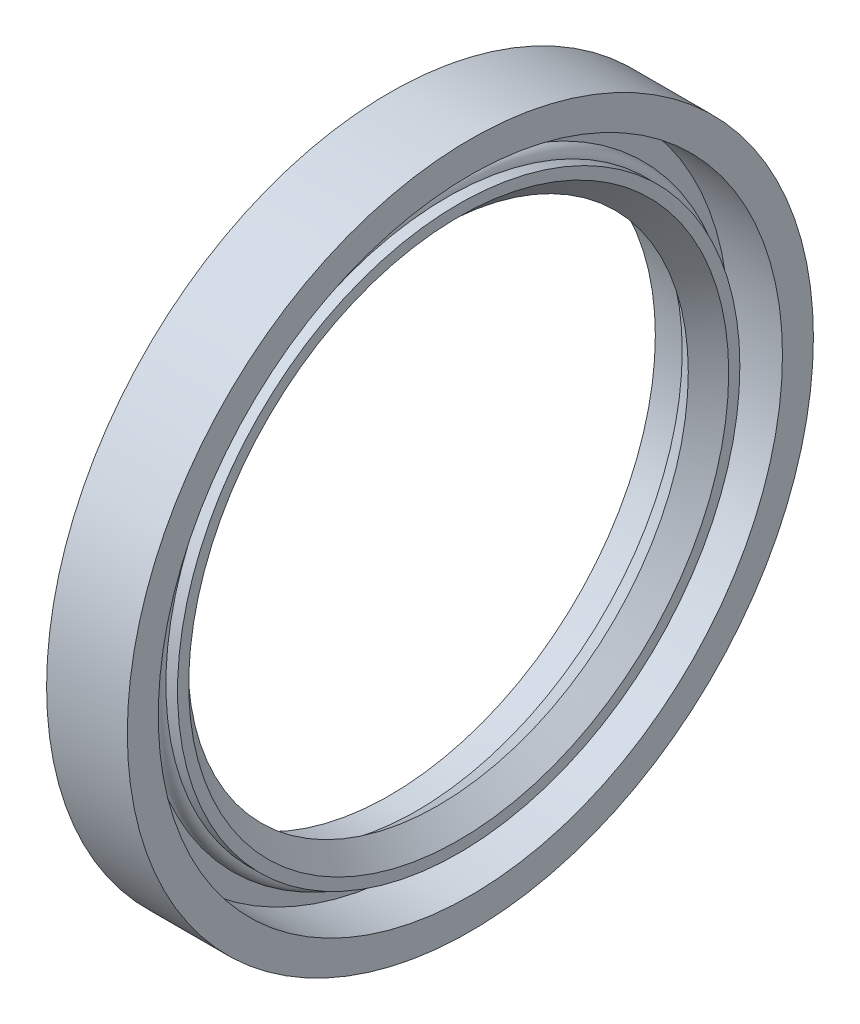
ISO-10303-21;
HEADER;
FILE_DESCRIPTION(('STEP AP214'),'2;1');
FILE_NAME('part.step','',(''),(''),'','','');
FILE_SCHEMA(('AUTOMOTIVE_DESIGN { 1 0 10303 214 1 1 1 1 }'));
ENDSEC;
DATA;
#1=APPLICATION_CONTEXT('core data for automotive mechanical design processes');
#2=APPLICATION_PROTOCOL_DEFINITION('international standard','automotive_design',2000,#1);
#3=PRODUCT_CONTEXT('',#1,'mechanical');
#4=PRODUCT('Part','Part','',(#3));
#5=PRODUCT_RELATED_PRODUCT_CATEGORY('part','',(#4));
#6=PRODUCT_DEFINITION_FORMATION('','',#4);
#7=PRODUCT_DEFINITION_CONTEXT('part definition',#1,'design');
#8=PRODUCT_DEFINITION('design','',#6,#7);
#9=PRODUCT_DEFINITION_SHAPE('','',#8);
#10=(LENGTH_UNIT() NAMED_UNIT(*) SI_UNIT(.MILLI.,.METRE.));
#11=(NAMED_UNIT(*) PLANE_ANGLE_UNIT() SI_UNIT($,.RADIAN.));
#12=(NAMED_UNIT(*) SI_UNIT($,.STERADIAN.) SOLID_ANGLE_UNIT());
#13=UNCERTAINTY_MEASURE_WITH_UNIT(LENGTH_MEASURE(1.E-05),#10,'distance_accuracy_value','');
#14=(GEOMETRIC_REPRESENTATION_CONTEXT(3) GLOBAL_UNCERTAINTY_ASSIGNED_CONTEXT((#13)) GLOBAL_UNIT_ASSIGNED_CONTEXT((#10,
#11,#12)) REPRESENTATION_CONTEXT('',''));
#15=CARTESIAN_POINT('',(0.,0.,0.));
#16=DIRECTION('',(0.,0.,1.));
#17=DIRECTION('',(1.,0.,0.));
#18=AXIS2_PLACEMENT_3D('',#15,#16,#17);
#19=CARTESIAN_POINT('',(10.,0.,0.));
#20=DIRECTION('',(1.,0.,0.));
#21=DIRECTION('',(0.,0.,-1.));
#22=AXIS2_PLACEMENT_3D('',#19,#20,#21);
#23=CYLINDRICAL_SURFACE('',#22,42.5);
#24=CARTESIAN_POINT('',(0.,0.,0.));
#25=DIRECTION('',(1.,0.,0.));
#26=DIRECTION('',(0.,0.,-1.));
#27=AXIS2_PLACEMENT_3D('',#24,#25,#26);
#28=CIRCLE('',#27,42.5);
#29=CARTESIAN_POINT('',(0.,0.,-42.5));
#30=VERTEX_POINT('',#29);
#31=EDGE_CURVE('E72',#30,#30,#28,.T.);
#32=ORIENTED_EDGE('',*,*,#31,.T.);
#33=EDGE_LOOP('',(#32));
#34=FACE_BOUND('',#33,.T.);
#35=CARTESIAN_POINT('',(10.,0.,0.));
#36=DIRECTION('',(1.,0.,0.));
#37=DIRECTION('',(0.,0.,-1.));
#38=AXIS2_PLACEMENT_3D('',#35,#36,#37);
#39=CIRCLE('',#38,42.5);
#40=CARTESIAN_POINT('',(10.,0.,-42.5));
#41=VERTEX_POINT('',#40);
#42=EDGE_CURVE('E68',#41,#41,#39,.T.);
#43=ORIENTED_EDGE('',*,*,#42,.F.);
#44=EDGE_LOOP('',(#43));
#45=FACE_BOUND('',#44,.T.);
#46=ADVANCED_FACE('F15',(#34,#45),#23,.T.);
#47=CARTESIAN_POINT('',(0.,42.5,0.));
#48=DIRECTION('',(-1.,0.,0.));
#49=DIRECTION('',(0.,0.,1.));
#50=AXIS2_PLACEMENT_3D('',#47,#48,#49);
#51=PLANE('',#50);
#52=CARTESIAN_POINT('',(0.,0.,0.));
#53=DIRECTION('',(1.,0.,0.));
#54=DIRECTION('',(0.,0.,-1.));
#55=AXIS2_PLACEMENT_3D('',#52,#53,#54);
#56=CIRCLE('',#55,32.916666666667);
#57=CARTESIAN_POINT('',(0.,0.,-32.916666666667));
#58=VERTEX_POINT('',#57);
#59=EDGE_CURVE('E64',#58,#58,#56,.T.);
#60=ORIENTED_EDGE('',*,*,#59,.T.);
#61=EDGE_LOOP('',(#60));
#62=FACE_BOUND('',#61,.T.);
#63=ORIENTED_EDGE('',*,*,#31,.F.);
#64=EDGE_LOOP('',(#63));
#65=FACE_BOUND('',#64,.T.);
#66=ADVANCED_FACE('F81',(#62,#65),#51,.T.);
#67=CARTESIAN_POINT('',(10.,38.666666666667,0.));
#68=DIRECTION('',(1.,0.,0.));
#69=DIRECTION('',(0.,0.,-1.));
#70=AXIS2_PLACEMENT_3D('',#67,#68,#69);
#71=PLANE('',#70);
#72=ORIENTED_EDGE('',*,*,#42,.T.);
#73=EDGE_LOOP('',(#72));
#74=FACE_BOUND('',#73,.T.);
#75=CARTESIAN_POINT('',(10.,0.,0.));
#76=DIRECTION('',(1.,0.,0.));
#77=DIRECTION('',(0.,0.,-1.));
#78=AXIS2_PLACEMENT_3D('',#75,#76,#77);
#79=CIRCLE('',#78,38.666666666667);
#80=CARTESIAN_POINT('',(10.,0.,-38.666666666667));
#81=VERTEX_POINT('',#80);
#82=EDGE_CURVE('E60',#81,#81,#79,.T.);
#83=ORIENTED_EDGE('',*,*,#82,.F.);
#84=EDGE_LOOP('',(#83));
#85=FACE_BOUND('',#84,.T.);
#86=ADVANCED_FACE('F83',(#74,#85),#71,.T.);
#87=CARTESIAN_POINT('',(10.,0.,0.));
#88=DIRECTION('',(1.,0.,0.));
#89=DIRECTION('',(0.,0.,-1.));
#90=AXIS2_PLACEMENT_3D('',#87,#88,#89);
#91=CYLINDRICAL_SURFACE('',#90,32.916666666667);
#92=CARTESIAN_POINT('',(3.3333333333333,0.,0.));
#93=DIRECTION('',(1.,0.,0.));
#94=DIRECTION('',(0.,0.,-1.));
#95=AXIS2_PLACEMENT_3D('',#92,#93,#94);
#96=CIRCLE('',#95,32.916666666667);
#97=CARTESIAN_POINT('',(3.3333333333333,0.,-32.916666666667));
#98=VERTEX_POINT('',#97);
#99=EDGE_CURVE('E56',#98,#98,#96,.T.);
#100=ORIENTED_EDGE('',*,*,#99,.T.);
#101=EDGE_LOOP('',(#100));
#102=FACE_BOUND('',#101,.T.);
#103=ORIENTED_EDGE('',*,*,#59,.F.);
#104=EDGE_LOOP('',(#103));
#105=FACE_BOUND('',#104,.T.);
#106=ADVANCED_FACE('F91',(#102,#105),#91,.F.);
#107=CARTESIAN_POINT('',(10.,0.,0.));
#108=DIRECTION('',(1.,0.,0.));
#109=DIRECTION('',(0.,0.,-1.));
#110=AXIS2_PLACEMENT_3D('',#107,#108,#109);
#111=CYLINDRICAL_SURFACE('',#110,38.666666666667);
#112=ORIENTED_EDGE('',*,*,#82,.T.);
#113=EDGE_LOOP('',(#112));
#114=FACE_BOUND('',#113,.T.);
#115=CARTESIAN_POINT('',(3.3333333333333,0.,0.));
#116=DIRECTION('',(1.,0.,0.));
#117=DIRECTION('',(0.,0.,-1.));
#118=AXIS2_PLACEMENT_3D('',#115,#116,#117);
#119=CIRCLE('',#118,38.666666666667);
#120=CARTESIAN_POINT('',(3.3333333333333,0.,-38.666666666667));
#121=VERTEX_POINT('',#120);
#122=EDGE_CURVE('E52',#121,#121,#119,.T.);
#123=ORIENTED_EDGE('',*,*,#122,.F.);
#124=EDGE_LOOP('',(#123));
#125=FACE_BOUND('',#124,.T.);
#126=ADVANCED_FACE('F98',(#114,#125),#111,.F.);
#127=CARTESIAN_POINT('',(3.3333333333333,0.,0.));
#128=DIRECTION('',(-1.,0.,0.));
#129=DIRECTION('',(0.,0.,1.));
#130=AXIS2_PLACEMENT_3D('',#127,#128,#129);
#131=CONICAL_SURFACE('',#130,32.916666666667,0.623199329934142);
#132=CARTESIAN_POINT('',(6.,0.,0.));
#133=DIRECTION('',(1.,0.,0.));
#134=DIRECTION('',(0.,0.,-1.));
#135=AXIS2_PLACEMENT_3D('',#132,#133,#134);
#136=CIRCLE('',#135,31.);
#137=CARTESIAN_POINT('',(6.,0.,-31.));
#138=VERTEX_POINT('',#137);
#139=EDGE_CURVE('E48',#138,#138,#136,.T.);
#140=ORIENTED_EDGE('',*,*,#139,.T.);
#141=EDGE_LOOP('',(#140));
#142=FACE_BOUND('',#141,.T.);
#143=ORIENTED_EDGE('',*,*,#99,.F.);
#144=EDGE_LOOP('',(#143));
#145=FACE_BOUND('',#144,.T.);
#146=ADVANCED_FACE('F102',(#142,#145),#131,.F.);
#147=CARTESIAN_POINT('',(3.3333333333333,34.833333333333,0.));
#148=DIRECTION('',(1.,0.,0.));
#149=DIRECTION('',(0.,0.,-1.));
#150=AXIS2_PLACEMENT_3D('',#147,#148,#149);
#151=PLANE('',#150);
#152=ORIENTED_EDGE('',*,*,#122,.T.);
#153=EDGE_LOOP('',(#152));
#154=FACE_BOUND('',#153,.T.);
#155=CARTESIAN_POINT('',(3.3333333333333,0.,0.));
#156=DIRECTION('',(1.,0.,0.));
#157=DIRECTION('',(0.,0.,-1.));
#158=AXIS2_PLACEMENT_3D('',#155,#156,#157);
#159=CIRCLE('',#158,34.833333333333);
#160=CARTESIAN_POINT('',(3.3333333333333,0.,-34.833333333333));
#161=VERTEX_POINT('',#160);
#162=EDGE_CURVE('E44',#161,#161,#159,.T.);
#163=ORIENTED_EDGE('',*,*,#162,.F.);
#164=EDGE_LOOP('',(#163));
#165=FACE_BOUND('',#164,.T.);
#166=ADVANCED_FACE('F106',(#154,#165),#151,.T.);
#167=CARTESIAN_POINT('',(6.,0.,0.));
#168=DIRECTION('',(1.,0.,0.));
#169=DIRECTION('',(0.,0.,-1.));
#170=AXIS2_PLACEMENT_3D('',#167,#168,#169);
#171=CONICAL_SURFACE('',#170,31.,0.764124777373319);
#172=CARTESIAN_POINT('',(8.5555555,0.,0.));
#173=DIRECTION('',(1.,0.,0.));
#174=DIRECTION('',(0.,0.,-1.));
#175=AXIS2_PLACEMENT_3D('',#172,#173,#174);
#176=CIRCLE('',#175,33.449074020833);
#177=CARTESIAN_POINT('',(8.5555555,0.,-33.449074020833));
#178=VERTEX_POINT('',#177);
#179=EDGE_CURVE('E38',#178,#178,#176,.T.);
#180=ORIENTED_EDGE('',*,*,#179,.T.);
#181=EDGE_LOOP('',(#180));
#182=FACE_BOUND('',#181,.T.);
#183=ORIENTED_EDGE('',*,*,#139,.F.);
#184=EDGE_LOOP('',(#183));
#185=FACE_BOUND('',#184,.T.);
#186=ADVANCED_FACE('F110',(#182,#185),#171,.F.);
#187=CARTESIAN_POINT('',(10.,0.,0.));
#188=DIRECTION('',(1.,0.,0.));
#189=DIRECTION('',(0.,0.,-1.));
#190=AXIS2_PLACEMENT_3D('',#187,#188,#189);
#191=CYLINDRICAL_SURFACE('',#190,34.833333333333);
#192=ORIENTED_EDGE('',*,*,#162,.T.);
#193=EDGE_LOOP('',(#192));
#194=FACE_BOUND('',#193,.T.);
#195=CARTESIAN_POINT('',(4.888889,0.,0.));
#196=DIRECTION('',(1.,0.,0.));
#197=DIRECTION('',(0.,0.,-1.));
#198=AXIS2_PLACEMENT_3D('',#195,#196,#197);
#199=CIRCLE('',#198,34.833333333333);
#200=CARTESIAN_POINT('',(4.888889,0.,-34.833333333333));
#201=VERTEX_POINT('',#200);
#202=EDGE_CURVE('E31',#201,#201,#199,.T.);
#203=ORIENTED_EDGE('',*,*,#202,.F.);
#204=EDGE_LOOP('',(#203));
#205=FACE_BOUND('',#204,.T.);
#206=ADVANCED_FACE('F114',(#194,#205),#191,.T.);
#207=CARTESIAN_POINT('',(8.5555555,33.449074020833,0.));
#208=DIRECTION('',(1.,0.,0.));
#209=DIRECTION('',(0.,0.,-1.));
#210=AXIS2_PLACEMENT_3D('',#207,#208,#209);
#211=PLANE('',#210);
#212=CARTESIAN_POINT('',(8.5555555,0.,0.));
#213=DIRECTION('',(1.,0.,0.));
#214=DIRECTION('',(0.,0.,-1.));
#215=AXIS2_PLACEMENT_3D('',#212,#213,#214);
#216=CIRCLE('',#215,34.833333333333);
#217=CARTESIAN_POINT('',(8.5555555,0.,-34.833333333333));
#218=VERTEX_POINT('',#217);
#219=EDGE_CURVE('E23',#218,#218,#216,.T.);
#220=ORIENTED_EDGE('',*,*,#219,.T.);
#221=EDGE_LOOP('',(#220));
#222=FACE_BOUND('',#221,.T.);
#223=ORIENTED_EDGE('',*,*,#179,.F.);
#224=EDGE_LOOP('',(#223));
#225=FACE_BOUND('',#224,.T.);
#226=ADVANCED_FACE('F118',(#222,#225),#211,.T.);
#227=CARTESIAN_POINT('',(6.,0.,0.));
#228=DIRECTION('',(1.,0.,0.));
#229=DIRECTION('',(0.,0.,-1.));
#230=AXIS2_PLACEMENT_3D('',#227,#228,#229);
#231=TOROIDAL_SURFACE('',#230,34.833333333333,1.111111);
#232=ORIENTED_EDGE('',*,*,#202,.T.);
#233=EDGE_LOOP('',(#232));
#234=FACE_BOUND('',#233,.T.);
#235=CARTESIAN_POINT('',(7.111111,0.,0.));
#236=DIRECTION('',(1.,0.,0.));
#237=DIRECTION('',(0.,0.,-1.));
#238=AXIS2_PLACEMENT_3D('',#235,#236,#237);
#239=CIRCLE('',#238,34.833333333333);
#240=CARTESIAN_POINT('',(7.111111,0.,-34.833333333333));
#241=VERTEX_POINT('',#240);
#242=EDGE_CURVE('E10',#241,#241,#239,.T.);
#243=ORIENTED_EDGE('',*,*,#242,.F.);
#244=EDGE_LOOP('',(#243));
#245=FACE_BOUND('',#244,.T.);
#246=ADVANCED_FACE('F121',(#234,#245),#231,.T.);
#247=CARTESIAN_POINT('',(10.,0.,0.));
#248=DIRECTION('',(1.,0.,0.));
#249=DIRECTION('',(0.,0.,-1.));
#250=AXIS2_PLACEMENT_3D('',#247,#248,#249);
#251=CYLINDRICAL_SURFACE('',#250,34.833333333333);
#252=ORIENTED_EDGE('',*,*,#242,.T.);
#253=EDGE_LOOP('',(#252));
#254=FACE_BOUND('',#253,.T.);
#255=ORIENTED_EDGE('',*,*,#219,.F.);
#256=EDGE_LOOP('',(#255));
#257=FACE_BOUND('',#256,.T.);
#258=ADVANCED_FACE('F17',(#254,#257),#251,.T.);
#259=CLOSED_SHELL('',(#46,#66,#86,#106,#126,#146,#166,#186,#206,#226,#246,#258));
#260=MANIFOLD_SOLID_BREP('B1',#259);
#261=ADVANCED_BREP_SHAPE_REPRESENTATION('',(#18,#260),#14);
#262=SHAPE_DEFINITION_REPRESENTATION(#9,#261);
ENDSEC;
END-ISO-10303-21;
